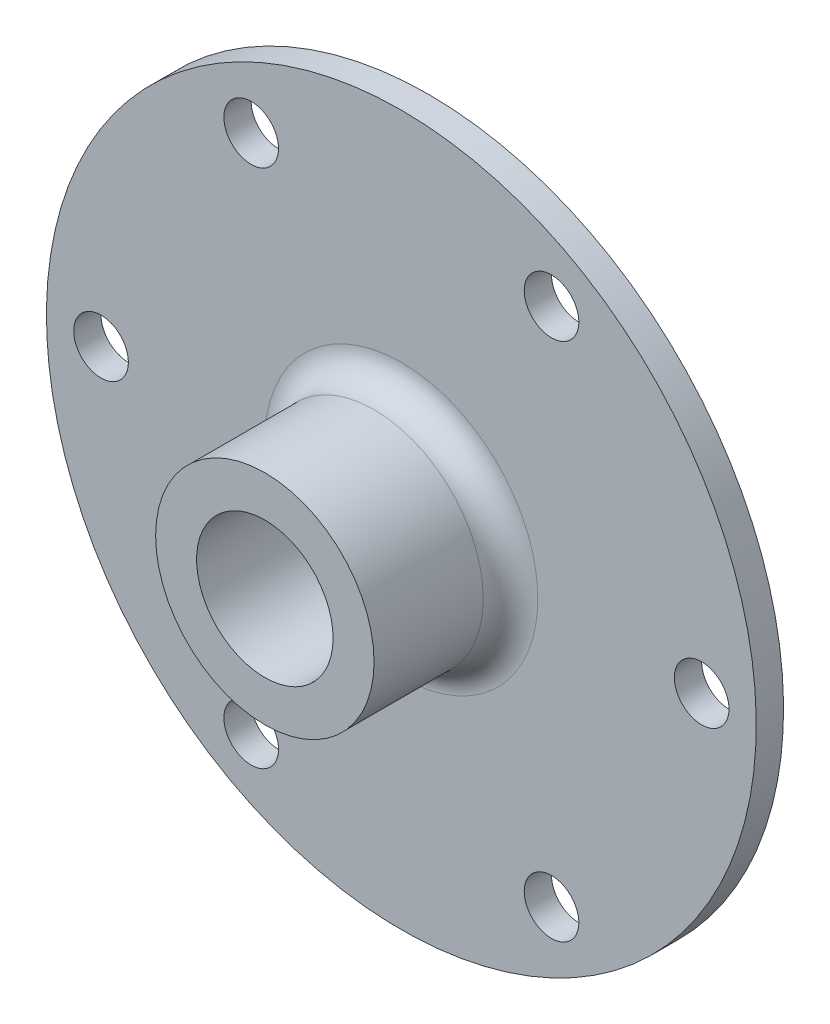
ISO-10303-21;
HEADER;
FILE_DESCRIPTION(('STEP AP214'),'2;1');
FILE_NAME('part.step','',(''),(''),'','','');
FILE_SCHEMA(('AUTOMOTIVE_DESIGN { 1 0 10303 214 1 1 1 1 }'));
ENDSEC;
DATA;
#1=APPLICATION_CONTEXT('core data for automotive mechanical design processes');
#2=APPLICATION_PROTOCOL_DEFINITION('international standard','automotive_design',2000,#1);
#3=PRODUCT_CONTEXT('',#1,'mechanical');
#4=PRODUCT('Part','Part','',(#3));
#5=PRODUCT_RELATED_PRODUCT_CATEGORY('part','',(#4));
#6=PRODUCT_DEFINITION_FORMATION('','',#4);
#7=PRODUCT_DEFINITION_CONTEXT('part definition',#1,'design');
#8=PRODUCT_DEFINITION('design','',#6,#7);
#9=PRODUCT_DEFINITION_SHAPE('','',#8);
#10=(LENGTH_UNIT() NAMED_UNIT(*) SI_UNIT(.MILLI.,.METRE.));
#11=(NAMED_UNIT(*) PLANE_ANGLE_UNIT() SI_UNIT($,.RADIAN.));
#12=(NAMED_UNIT(*) SI_UNIT($,.STERADIAN.) SOLID_ANGLE_UNIT());
#13=UNCERTAINTY_MEASURE_WITH_UNIT(LENGTH_MEASURE(1.E-05),#10,'distance_accuracy_value','');
#14=(GEOMETRIC_REPRESENTATION_CONTEXT(3) GLOBAL_UNCERTAINTY_ASSIGNED_CONTEXT((#13)) GLOBAL_UNIT_ASSIGNED_CONTEXT((#10,
#11,#12)) REPRESENTATION_CONTEXT('',''));
#15=CARTESIAN_POINT('',(0.,0.,0.));
#16=DIRECTION('',(0.,0.,1.));
#17=DIRECTION('',(1.,0.,0.));
#18=AXIS2_PLACEMENT_3D('',#15,#16,#17);
#19=CARTESIAN_POINT('',(17.4625000000004,30.2459372271713,0.));
#20=DIRECTION('',(0.,0.,1.));
#21=DIRECTION('',(0.50000000000001,0.866025403784433,0.));
#22=AXIS2_PLACEMENT_3D('',#19,#20,#21);
#23=CYLINDRICAL_SURFACE('',#22,3.175);
#24=CARTESIAN_POINT('',(17.4625000000004,30.2459372271713,0.));
#25=DIRECTION('',(0.,0.,1.));
#26=DIRECTION('',(0.50000000000001,0.866025403784433,0.));
#27=AXIS2_PLACEMENT_3D('',#24,#25,#26);
#28=CIRCLE('',#27,3.175);
#29=CARTESIAN_POINT('',(19.0500000000004,32.9955678841869,0.));
#30=VERTEX_POINT('',#29);
#31=EDGE_CURVE('E46',#30,#30,#28,.T.);
#32=ORIENTED_EDGE('',*,*,#31,.F.);
#33=EDGE_LOOP('',(#32));
#34=FACE_BOUND('',#33,.T.);
#35=CARTESIAN_POINT('',(17.4625000000004,30.2459372271713,3.175));
#36=DIRECTION('',(0.,0.,1.));
#37=DIRECTION('',(0.50000000000001,0.866025403784433,0.));
#38=AXIS2_PLACEMENT_3D('',#35,#36,#37);
#39=CIRCLE('',#38,3.175);
#40=CARTESIAN_POINT('',(19.0500000000004,32.9955678841869,3.175));
#41=VERTEX_POINT('',#40);
#42=EDGE_CURVE('E42',#41,#41,#39,.T.);
#43=ORIENTED_EDGE('',*,*,#42,.T.);
#44=EDGE_LOOP('',(#43));
#45=FACE_BOUND('',#44,.T.);
#46=ADVANCED_FACE('F31',(#34,#45),#23,.F.);
#47=CARTESIAN_POINT('',(-17.4624999999997,30.2459372271717,0.));
#48=DIRECTION('',(0.,0.,1.));
#49=DIRECTION('',(-0.499999999999992,0.866025403784443,0.));
#50=AXIS2_PLACEMENT_3D('',#47,#48,#49);
#51=CYLINDRICAL_SURFACE('',#50,3.175);
#52=CARTESIAN_POINT('',(-17.4624999999997,30.2459372271717,0.));
#53=DIRECTION('',(0.,0.,1.));
#54=DIRECTION('',(-0.499999999999992,0.866025403784443,0.));
#55=AXIS2_PLACEMENT_3D('',#52,#53,#54);
#56=CIRCLE('',#55,3.175);
#57=CARTESIAN_POINT('',(-19.0499999999997,32.9955678841873,0.));
#58=VERTEX_POINT('',#57);
#59=EDGE_CURVE('E54',#58,#58,#56,.T.);
#60=ORIENTED_EDGE('',*,*,#59,.F.);
#61=EDGE_LOOP('',(#60));
#62=FACE_BOUND('',#61,.T.);
#63=CARTESIAN_POINT('',(-17.4624999999997,30.2459372271717,3.175));
#64=DIRECTION('',(0.,0.,1.));
#65=DIRECTION('',(-0.499999999999992,0.866025403784443,0.));
#66=AXIS2_PLACEMENT_3D('',#63,#64,#65);
#67=CIRCLE('',#66,3.175);
#68=CARTESIAN_POINT('',(-19.0499999999997,32.9955678841873,3.175));
#69=VERTEX_POINT('',#68);
#70=EDGE_CURVE('E51',#69,#69,#67,.T.);
#71=ORIENTED_EDGE('',*,*,#70,.T.);
#72=EDGE_LOOP('',(#71));
#73=FACE_BOUND('',#72,.T.);
#74=ADVANCED_FACE('F130',(#62,#73),#51,.F.);
#75=CARTESIAN_POINT('',(-34.925,0.,0.));
#76=DIRECTION('',(0.,0.,1.));
#77=DIRECTION('',(-1.,0.,0.));
#78=AXIS2_PLACEMENT_3D('',#75,#76,#77);
#79=CYLINDRICAL_SURFACE('',#78,3.175);
#80=CARTESIAN_POINT('',(-34.925,0.,0.));
#81=DIRECTION('',(0.,0.,1.));
#82=DIRECTION('',(-1.,0.,0.));
#83=AXIS2_PLACEMENT_3D('',#80,#81,#82);
#84=CIRCLE('',#83,3.175);
#85=CARTESIAN_POINT('',(-38.1,0.,0.));
#86=VERTEX_POINT('',#85);
#87=EDGE_CURVE('E60',#86,#86,#84,.T.);
#88=ORIENTED_EDGE('',*,*,#87,.F.);
#89=EDGE_LOOP('',(#88));
#90=FACE_BOUND('',#89,.T.);
#91=CARTESIAN_POINT('',(-34.925,0.,3.175));
#92=DIRECTION('',(0.,0.,1.));
#93=DIRECTION('',(-1.,0.,0.));
#94=AXIS2_PLACEMENT_3D('',#91,#92,#93);
#95=CIRCLE('',#94,3.175);
#96=CARTESIAN_POINT('',(-38.1,0.,3.175));
#97=VERTEX_POINT('',#96);
#98=EDGE_CURVE('E57',#97,#97,#95,.T.);
#99=ORIENTED_EDGE('',*,*,#98,.T.);
#100=EDGE_LOOP('',(#99));
#101=FACE_BOUND('',#100,.T.);
#102=ADVANCED_FACE('F135',(#90,#101),#79,.F.);
#103=CARTESIAN_POINT('',(-17.4625000000001,-30.2459372271714,0.));
#104=DIRECTION('',(0.,0.,1.));
#105=DIRECTION('',(-0.500000000000004,-0.866025403784436,0.));
#106=AXIS2_PLACEMENT_3D('',#103,#104,#105);
#107=CYLINDRICAL_SURFACE('',#106,3.175);
#108=CARTESIAN_POINT('',(-17.4625000000001,-30.2459372271714,0.));
#109=DIRECTION('',(0.,0.,1.));
#110=DIRECTION('',(-0.500000000000004,-0.866025403784436,0.));
#111=AXIS2_PLACEMENT_3D('',#108,#109,#110);
#112=CIRCLE('',#111,3.175);
#113=CARTESIAN_POINT('',(-19.0500000000002,-32.995567884187,0.));
#114=VERTEX_POINT('',#113);
#115=EDGE_CURVE('E66',#114,#114,#112,.T.);
#116=ORIENTED_EDGE('',*,*,#115,.F.);
#117=EDGE_LOOP('',(#116));
#118=FACE_BOUND('',#117,.T.);
#119=CARTESIAN_POINT('',(-17.4625000000001,-30.2459372271714,3.17499999999999));
#120=DIRECTION('',(0.,0.,1.));
#121=DIRECTION('',(-0.500000000000004,-0.866025403784436,0.));
#122=AXIS2_PLACEMENT_3D('',#119,#120,#121);
#123=CIRCLE('',#122,3.175);
#124=CARTESIAN_POINT('',(-19.0500000000002,-32.995567884187,3.17499999999999));
#125=VERTEX_POINT('',#124);
#126=EDGE_CURVE('E63',#125,#125,#123,.T.);
#127=ORIENTED_EDGE('',*,*,#126,.T.);
#128=EDGE_LOOP('',(#127));
#129=FACE_BOUND('',#128,.T.);
#130=ADVANCED_FACE('F143',(#118,#129),#107,.F.);
#131=CARTESIAN_POINT('',(17.4624999999999,-30.2459372271716,0.));
#132=DIRECTION('',(0.,0.,1.));
#133=DIRECTION('',(0.499999999999998,-0.86602540378444,0.));
#134=AXIS2_PLACEMENT_3D('',#131,#132,#133);
#135=CYLINDRICAL_SURFACE('',#134,3.175);
#136=CARTESIAN_POINT('',(17.4624999999999,-30.2459372271716,0.));
#137=DIRECTION('',(0.,0.,1.));
#138=DIRECTION('',(0.499999999999998,-0.86602540378444,0.));
#139=AXIS2_PLACEMENT_3D('',#136,#137,#138);
#140=CIRCLE('',#139,3.175);
#141=CARTESIAN_POINT('',(19.0499999999999,-32.9955678841872,0.));
#142=VERTEX_POINT('',#141);
#143=EDGE_CURVE('E72',#142,#142,#140,.T.);
#144=ORIENTED_EDGE('',*,*,#143,.F.);
#145=EDGE_LOOP('',(#144));
#146=FACE_BOUND('',#145,.T.);
#147=CARTESIAN_POINT('',(17.4624999999999,-30.2459372271716,3.17499999999999));
#148=DIRECTION('',(0.,0.,1.));
#149=DIRECTION('',(0.499999999999998,-0.86602540378444,0.));
#150=AXIS2_PLACEMENT_3D('',#147,#148,#149);
#151=CIRCLE('',#150,3.175);
#152=CARTESIAN_POINT('',(19.0499999999999,-32.9955678841872,3.17499999999999));
#153=VERTEX_POINT('',#152);
#154=EDGE_CURVE('E69',#153,#153,#151,.T.);
#155=ORIENTED_EDGE('',*,*,#154,.T.);
#156=EDGE_LOOP('',(#155));
#157=FACE_BOUND('',#156,.T.);
#158=ADVANCED_FACE('F147',(#146,#157),#135,.F.);
#159=CARTESIAN_POINT('',(0.,0.,19.05));
#160=DIRECTION('',(0.,0.,1.));
#161=DIRECTION('',(0.,-1.,0.));
#162=AXIS2_PLACEMENT_3D('',#159,#160,#161);
#163=PLANE('',#162);
#164=CARTESIAN_POINT('',(0.,0.,19.05));
#165=DIRECTION('',(0.,0.,1.));
#166=DIRECTION('',(1.,0.,0.));
#167=AXIS2_PLACEMENT_3D('',#164,#165,#166);
#168=CIRCLE('',#167,7.9375);
#169=CARTESIAN_POINT('',(7.9375,0.,19.05));
#170=VERTEX_POINT('',#169);
#171=EDGE_CURVE('E85',#170,#170,#168,.T.);
#172=ORIENTED_EDGE('',*,*,#171,.F.);
#173=EDGE_LOOP('',(#172));
#174=FACE_BOUND('',#173,.T.);
#175=CARTESIAN_POINT('',(0.,0.,19.05));
#176=DIRECTION('',(0.,0.,-1.));
#177=DIRECTION('',(0.,1.,0.));
#178=AXIS2_PLACEMENT_3D('',#175,#176,#177);
#179=CIRCLE('',#178,12.7);
#180=CARTESIAN_POINT('',(0.,12.7,19.05));
#181=VERTEX_POINT('',#180);
#182=EDGE_CURVE('E75',#181,#181,#179,.T.);
#183=ORIENTED_EDGE('',*,*,#182,.F.);
#184=EDGE_LOOP('',(#183));
#185=FACE_BOUND('',#184,.T.);
#186=ADVANCED_FACE('F151',(#174,#185),#163,.T.);
#187=CARTESIAN_POINT('',(0.,0.,0.));
#188=DIRECTION('',(0.,0.,-1.));
#189=DIRECTION('',(0.,1.,0.));
#190=AXIS2_PLACEMENT_3D('',#187,#188,#189);
#191=CYLINDRICAL_SURFACE('',#190,12.7);
#192=CARTESIAN_POINT('',(0.,0.,6.35));
#193=DIRECTION('',(0.,0.,1.));
#194=DIRECTION('',(0.,-1.,0.));
#195=AXIS2_PLACEMENT_3D('',#192,#193,#194);
#196=CIRCLE('',#195,12.7);
#197=CARTESIAN_POINT('',(0.,-12.7,6.34999999999999));
#198=VERTEX_POINT('',#197);
#199=EDGE_CURVE('E10',#198,#198,#196,.T.);
#200=ORIENTED_EDGE('',*,*,#199,.T.);
#201=EDGE_LOOP('',(#200));
#202=FACE_BOUND('',#201,.T.);
#203=ORIENTED_EDGE('',*,*,#182,.T.);
#204=EDGE_LOOP('',(#203));
#205=FACE_BOUND('',#204,.T.);
#206=ADVANCED_FACE('F111',(#202,#205),#191,.T.);
#207=CARTESIAN_POINT('',(0.,12.7,3.175));
#208=DIRECTION('',(0.,0.,1.));
#209=DIRECTION('',(0.,-1.,0.));
#210=AXIS2_PLACEMENT_3D('',#207,#208,#209);
#211=PLANE('',#210);
#212=CARTESIAN_POINT('',(0.,0.,3.175));
#213=DIRECTION('',(0.,0.,1.));
#214=DIRECTION('',(0.,-1.,0.));
#215=AXIS2_PLACEMENT_3D('',#212,#213,#214);
#216=CIRCLE('',#215,15.875);
#217=CARTESIAN_POINT('',(0.,-15.875,3.17499999999999));
#218=VERTEX_POINT('',#217);
#219=EDGE_CURVE('E38',#218,#218,#216,.F.);
#220=ORIENTED_EDGE('',*,*,#219,.T.);
#221=EDGE_LOOP('',(#220));
#222=FACE_BOUND('',#221,.T.);
#223=ORIENTED_EDGE('',*,*,#42,.F.);
#224=EDGE_LOOP('',(#223));
#225=FACE_BOUND('',#224,.T.);
#226=ORIENTED_EDGE('',*,*,#70,.F.);
#227=EDGE_LOOP('',(#226));
#228=FACE_BOUND('',#227,.T.);
#229=ORIENTED_EDGE('',*,*,#98,.F.);
#230=EDGE_LOOP('',(#229));
#231=FACE_BOUND('',#230,.T.);
#232=ORIENTED_EDGE('',*,*,#126,.F.);
#233=EDGE_LOOP('',(#232));
#234=FACE_BOUND('',#233,.T.);
#235=ORIENTED_EDGE('',*,*,#154,.F.);
#236=EDGE_LOOP('',(#235));
#237=FACE_BOUND('',#236,.T.);
#238=CARTESIAN_POINT('',(34.925,0.,3.175));
#239=DIRECTION('',(0.,0.,1.));
#240=DIRECTION('',(1.,0.,0.));
#241=AXIS2_PLACEMENT_3D('',#238,#239,#240);
#242=CIRCLE('',#241,3.175);
#243=CARTESIAN_POINT('',(38.1,0.,3.175));
#244=VERTEX_POINT('',#243);
#245=EDGE_CURVE('E91',#244,#244,#242,.T.);
#246=ORIENTED_EDGE('',*,*,#245,.F.);
#247=EDGE_LOOP('',(#246));
#248=FACE_BOUND('',#247,.T.);
#249=CARTESIAN_POINT('',(0.,0.,3.17499999999999));
#250=DIRECTION('',(0.,0.,-1.));
#251=DIRECTION('',(0.,1.,0.));
#252=AXIS2_PLACEMENT_3D('',#249,#250,#251);
#253=CIRCLE('',#252,41.275);
#254=CARTESIAN_POINT('',(0.,41.275,3.175));
#255=VERTEX_POINT('',#254);
#256=EDGE_CURVE('E78',#255,#255,#253,.T.);
#257=ORIENTED_EDGE('',*,*,#256,.F.);
#258=EDGE_LOOP('',(#257));
#259=FACE_BOUND('',#258,.T.);
#260=ADVANCED_FACE('F107',(#222,#225,#228,#231,#234,#237,#248,#259),#211,.T.);
#261=CARTESIAN_POINT('',(0.,0.,0.));
#262=DIRECTION('',(0.,0.,-1.));
#263=DIRECTION('',(0.,1.,0.));
#264=AXIS2_PLACEMENT_3D('',#261,#262,#263);
#265=CYLINDRICAL_SURFACE('',#264,41.275);
#266=ORIENTED_EDGE('',*,*,#256,.T.);
#267=EDGE_LOOP('',(#266));
#268=FACE_BOUND('',#267,.T.);
#269=CARTESIAN_POINT('',(0.,0.,0.));
#270=DIRECTION('',(0.,0.,-1.));
#271=DIRECTION('',(0.,1.,0.));
#272=AXIS2_PLACEMENT_3D('',#269,#270,#271);
#273=CIRCLE('',#272,41.275);
#274=CARTESIAN_POINT('',(0.,41.275,0.));
#275=VERTEX_POINT('',#274);
#276=EDGE_CURVE('E81',#275,#275,#273,.T.);
#277=ORIENTED_EDGE('',*,*,#276,.F.);
#278=EDGE_LOOP('',(#277));
#279=FACE_BOUND('',#278,.T.);
#280=ADVANCED_FACE('F110',(#268,#279),#265,.T.);
#281=CARTESIAN_POINT('',(0.,0.,0.));
#282=DIRECTION('',(0.,0.,-1.));
#283=DIRECTION('',(0.,1.,0.));
#284=AXIS2_PLACEMENT_3D('',#281,#282,#283);
#285=PLANE('',#284);
#286=ORIENTED_EDGE('',*,*,#31,.T.);
#287=EDGE_LOOP('',(#286));
#288=FACE_BOUND('',#287,.T.);
#289=ORIENTED_EDGE('',*,*,#59,.T.);
#290=EDGE_LOOP('',(#289));
#291=FACE_BOUND('',#290,.T.);
#292=ORIENTED_EDGE('',*,*,#87,.T.);
#293=EDGE_LOOP('',(#292));
#294=FACE_BOUND('',#293,.T.);
#295=ORIENTED_EDGE('',*,*,#115,.T.);
#296=EDGE_LOOP('',(#295));
#297=FACE_BOUND('',#296,.T.);
#298=ORIENTED_EDGE('',*,*,#143,.T.);
#299=EDGE_LOOP('',(#298));
#300=FACE_BOUND('',#299,.T.);
#301=CARTESIAN_POINT('',(34.925,0.,0.));
#302=DIRECTION('',(0.,0.,1.));
#303=DIRECTION('',(1.,0.,0.));
#304=AXIS2_PLACEMENT_3D('',#301,#302,#303);
#305=CIRCLE('',#304,3.175);
#306=CARTESIAN_POINT('',(38.1,0.,0.));
#307=VERTEX_POINT('',#306);
#308=EDGE_CURVE('E88',#307,#307,#305,.T.);
#309=ORIENTED_EDGE('',*,*,#308,.T.);
#310=EDGE_LOOP('',(#309));
#311=FACE_BOUND('',#310,.T.);
#312=CARTESIAN_POINT('',(0.,0.,0.));
#313=DIRECTION('',(0.,0.,1.));
#314=DIRECTION('',(1.,0.,0.));
#315=AXIS2_PLACEMENT_3D('',#312,#313,#314);
#316=CIRCLE('',#315,7.9375);
#317=CARTESIAN_POINT('',(7.9375,0.,0.));
#318=VERTEX_POINT('',#317);
#319=EDGE_CURVE('E84',#318,#318,#316,.T.);
#320=ORIENTED_EDGE('',*,*,#319,.T.);
#321=EDGE_LOOP('',(#320));
#322=FACE_BOUND('',#321,.T.);
#323=ORIENTED_EDGE('',*,*,#276,.T.);
#324=EDGE_LOOP('',(#323));
#325=FACE_BOUND('',#324,.T.);
#326=ADVANCED_FACE('F97',(#288,#291,#294,#297,#300,#311,#322,#325),#285,.T.);
#327=CARTESIAN_POINT('',(0.,0.,0.));
#328=DIRECTION('',(0.,0.,1.));
#329=DIRECTION('',(1.,0.,0.));
#330=AXIS2_PLACEMENT_3D('',#327,#328,#329);
#331=CYLINDRICAL_SURFACE('',#330,7.9375);
#332=CARTESIAN_POINT('',(7.9375,0.,0.));
#333=CARTESIAN_POINT('',(7.9375,0.,0.1984375));
#334=CARTESIAN_POINT('',(7.9375,0.,0.396875));
#335=CARTESIAN_POINT('',(7.9375,0.,0.79375));
#336=CARTESIAN_POINT('',(7.9375,0.,0.9921875));
#337=CARTESIAN_POINT('',(7.9375,0.,1.3890625));
#338=CARTESIAN_POINT('',(7.9375,0.,1.5875));
#339=CARTESIAN_POINT('',(7.9375,0.,1.984375));
#340=CARTESIAN_POINT('',(7.9375,0.,2.1828125));
#341=CARTESIAN_POINT('',(7.9375,0.,2.5796875));
#342=CARTESIAN_POINT('',(7.9375,0.,2.778125));
#343=CARTESIAN_POINT('',(7.9375,0.,3.175));
#344=CARTESIAN_POINT('',(7.9375,0.,3.3734375));
#345=CARTESIAN_POINT('',(7.9375,0.,3.7703125));
#346=CARTESIAN_POINT('',(7.9375,0.,3.96875));
#347=CARTESIAN_POINT('',(7.9375,0.,4.365625));
#348=CARTESIAN_POINT('',(7.9375,0.,4.5640625));
#349=CARTESIAN_POINT('',(7.9375,0.,4.9609375));
#350=CARTESIAN_POINT('',(7.9375,0.,5.159375));
#351=CARTESIAN_POINT('',(7.9375,0.,5.55625));
#352=CARTESIAN_POINT('',(7.9375,0.,5.7546875));
#353=CARTESIAN_POINT('',(7.9375,0.,6.1515625));
#354=CARTESIAN_POINT('',(7.9375,0.,6.35));
#355=CARTESIAN_POINT('',(7.9375,0.,6.746875));
#356=CARTESIAN_POINT('',(7.9375,0.,6.9453125));
#357=CARTESIAN_POINT('',(7.9375,0.,7.3421875));
#358=CARTESIAN_POINT('',(7.9375,0.,7.540625));
#359=CARTESIAN_POINT('',(7.9375,0.,7.9375));
#360=CARTESIAN_POINT('',(7.9375,0.,8.1359375));
#361=CARTESIAN_POINT('',(7.9375,0.,8.5328125));
#362=CARTESIAN_POINT('',(7.9375,0.,8.73125));
#363=CARTESIAN_POINT('',(7.9375,0.,9.128125));
#364=CARTESIAN_POINT('',(7.9375,0.,9.3265625));
#365=CARTESIAN_POINT('',(7.9375,0.,9.7234375));
#366=CARTESIAN_POINT('',(7.9375,0.,9.921875));
#367=CARTESIAN_POINT('',(7.9375,0.,10.31875));
#368=CARTESIAN_POINT('',(7.9375,0.,10.5171875));
#369=CARTESIAN_POINT('',(7.9375,0.,10.9140625));
#370=CARTESIAN_POINT('',(7.9375,0.,11.1125));
#371=CARTESIAN_POINT('',(7.9375,0.,11.509375));
#372=CARTESIAN_POINT('',(7.9375,0.,11.7078125));
#373=CARTESIAN_POINT('',(7.9375,0.,12.1046875));
#374=CARTESIAN_POINT('',(7.9375,0.,12.303125));
#375=CARTESIAN_POINT('',(7.9375,0.,12.7));
#376=CARTESIAN_POINT('',(7.9375,0.,12.8984375));
#377=CARTESIAN_POINT('',(7.9375,0.,13.2953125));
#378=CARTESIAN_POINT('',(7.9375,0.,13.49375));
#379=CARTESIAN_POINT('',(7.9375,0.,13.890625));
#380=CARTESIAN_POINT('',(7.9375,0.,14.0890625));
#381=CARTESIAN_POINT('',(7.9375,0.,14.4859375));
#382=CARTESIAN_POINT('',(7.9375,0.,14.684375));
#383=CARTESIAN_POINT('',(7.9375,0.,15.08125));
#384=CARTESIAN_POINT('',(7.9375,0.,15.2796875));
#385=CARTESIAN_POINT('',(7.9375,0.,15.6765625));
#386=CARTESIAN_POINT('',(7.9375,0.,15.875));
#387=CARTESIAN_POINT('',(7.9375,0.,16.271875));
#388=CARTESIAN_POINT('',(7.9375,0.,16.4703125));
#389=CARTESIAN_POINT('',(7.9375,0.,16.8671875));
#390=CARTESIAN_POINT('',(7.9375,0.,17.065625));
#391=CARTESIAN_POINT('',(7.9375,0.,17.4625));
#392=CARTESIAN_POINT('',(7.9375,0.,17.6609375));
#393=CARTESIAN_POINT('',(7.9375,0.,18.0578125));
#394=CARTESIAN_POINT('',(7.9375,0.,18.25625));
#395=CARTESIAN_POINT('',(7.9375,0.,18.653125));
#396=CARTESIAN_POINT('',(7.9375,0.,18.8515625));
#397=CARTESIAN_POINT('',(7.9375,0.,19.05));
#398=B_SPLINE_CURVE_WITH_KNOTS('',3,(#332,#333,#334,#335,#336,#337,#338,#339,#340,#341,#342,
#343,#344,#345,#346,#347,#348,#349,#350,#351,#352,#353,#354,#355,#356,#357,#358,#359,#360,#361,
#362,#363,#364,#365,#366,#367,#368,#369,#370,#371,#372,#373,#374,#375,#376,#377,#378,#379,#380,
#381,#382,#383,#384,#385,#386,#387,#388,#389,#390,#391,#392,#393,#394,#395,#396,#397),
.UNSPECIFIED.,.F.,.F.,(4,2,2,2,2,2,2,2,2,2,2,2,2,2,2,2,2,2,2,2,2,2,2,2,2,2,2,2,2,2,2,2,4),(0.,
0.5953125,1.190625,1.7859375,2.38125,2.9765625,3.571875,4.1671875,4.7625,5.3578125,5.953125,
6.5484375,7.14375,7.7390625,8.334375,8.9296875,9.525,10.1203125,10.715625,11.3109375,11.90625,
12.5015625,13.096875,13.6921875,14.2875,14.8828125,15.478125,16.0734375,16.66875,17.2640625,
17.859375,18.4546875,19.05),.UNSPECIFIED.);
#399=EDGE_CURVE('BSEAM103',#318,#170,#398,.T.);
#400=ORIENTED_EDGE('',*,*,#319,.F.);
#401=ORIENTED_EDGE('',*,*,#171,.T.);
#402=ORIENTED_EDGE('',*,*,#399,.T.);
#403=ORIENTED_EDGE('',*,*,#399,.F.);
#404=EDGE_LOOP('',(#400,#402,#401,#403));
#405=FACE_BOUND('',#404,.T.);
#406=ADVANCED_FACE('F103',(#405),#331,.F.);
#407=CARTESIAN_POINT('',(34.925,0.,0.));
#408=DIRECTION('',(0.,0.,1.));
#409=DIRECTION('',(1.,0.,0.));
#410=AXIS2_PLACEMENT_3D('',#407,#408,#409);
#411=CYLINDRICAL_SURFACE('',#410,3.175);
#412=ORIENTED_EDGE('',*,*,#308,.F.);
#413=EDGE_LOOP('',(#412));
#414=FACE_BOUND('',#413,.T.);
#415=ORIENTED_EDGE('',*,*,#245,.T.);
#416=EDGE_LOOP('',(#415));
#417=FACE_BOUND('',#416,.T.);
#418=ADVANCED_FACE('F100',(#414,#417),#411,.F.);
#419=CARTESIAN_POINT('',(0.,0.,6.35));
#420=DIRECTION('',(0.,0.,1.));
#421=DIRECTION('',(0.,-1.,0.));
#422=AXIS2_PLACEMENT_3D('',#419,#420,#421);
#423=TOROIDAL_SURFACE('',#422,15.875,3.175);
#424=ORIENTED_EDGE('',*,*,#199,.F.);
#425=EDGE_LOOP('',(#424));
#426=FACE_BOUND('',#425,.T.);
#427=ORIENTED_EDGE('',*,*,#219,.F.);
#428=EDGE_LOOP('',(#427));
#429=FACE_BOUND('',#428,.T.);
#430=ADVANCED_FACE('F33',(#426,#429),#423,.F.);
#431=CLOSED_SHELL('',(#46,#74,#102,#130,#158,#186,#206,#260,#280,#326,#406,#418,#430));
#432=MANIFOLD_SOLID_BREP('B2',#431);
#433=ADVANCED_BREP_SHAPE_REPRESENTATION('',(#18,#432),#14);
#434=SHAPE_DEFINITION_REPRESENTATION(#9,#433);
ENDSEC;
END-ISO-10303-21;
